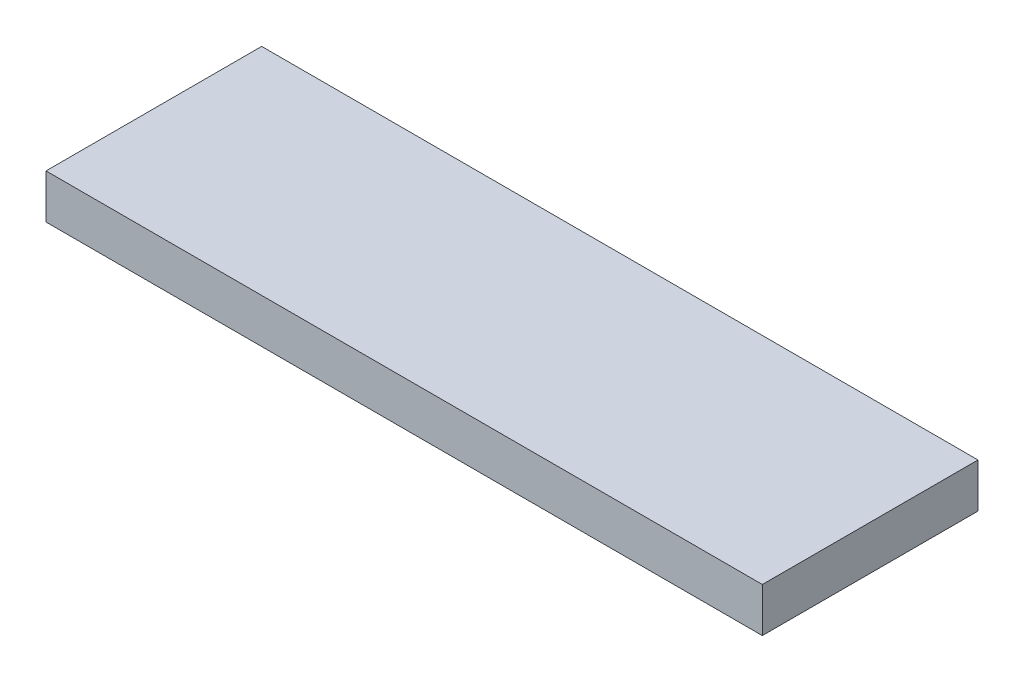
ISO-10303-21;
HEADER;
FILE_DESCRIPTION(('STEP AP214'),'2;1');
FILE_NAME('part.step','',(''),(''),'','','');
FILE_SCHEMA(('AUTOMOTIVE_DESIGN { 1 0 10303 214 1 1 1 1 }'));
ENDSEC;
DATA;
#1=APPLICATION_CONTEXT('core data for automotive mechanical design processes');
#2=APPLICATION_PROTOCOL_DEFINITION('international standard','automotive_design',2000,#1);
#3=PRODUCT_CONTEXT('',#1,'mechanical');
#4=PRODUCT('Part','Part','',(#3));
#5=PRODUCT_RELATED_PRODUCT_CATEGORY('part','',(#4));
#6=PRODUCT_DEFINITION_FORMATION('','',#4);
#7=PRODUCT_DEFINITION_CONTEXT('part definition',#1,'design');
#8=PRODUCT_DEFINITION('design','',#6,#7);
#9=PRODUCT_DEFINITION_SHAPE('','',#8);
#10=(LENGTH_UNIT() NAMED_UNIT(*) SI_UNIT(.MILLI.,.METRE.));
#11=(NAMED_UNIT(*) PLANE_ANGLE_UNIT() SI_UNIT($,.RADIAN.));
#12=(NAMED_UNIT(*) SI_UNIT($,.STERADIAN.) SOLID_ANGLE_UNIT());
#13=UNCERTAINTY_MEASURE_WITH_UNIT(LENGTH_MEASURE(1.E-05),#10,'distance_accuracy_value','');
#14=(GEOMETRIC_REPRESENTATION_CONTEXT(3) GLOBAL_UNCERTAINTY_ASSIGNED_CONTEXT((#13)) GLOBAL_UNIT_ASSIGNED_CONTEXT((#10,
#11,#12)) REPRESENTATION_CONTEXT('',''));
#15=CARTESIAN_POINT('',(0.,0.,0.));
#16=DIRECTION('',(0.,0.,1.));
#17=DIRECTION('',(1.,0.,0.));
#18=AXIS2_PLACEMENT_3D('',#15,#16,#17);
#19=CARTESIAN_POINT('',(147.6375,18.25625,-44.45));
#20=DIRECTION('',(-1.,0.,0.));
#21=DIRECTION('',(0.,0.,1.));
#22=AXIS2_PLACEMENT_3D('',#19,#20,#21);
#23=PLANE('',#22);
#24=DIRECTION('',(0.,0.,-1.));
#25=VECTOR('',#24,1.);
#26=CARTESIAN_POINT('',(147.6375,0.,-44.45));
#27=LINE('',#26,#25);
#28=CARTESIAN_POINT('',(147.6375,0.,44.45));
#29=VERTEX_POINT('',#28);
#30=CARTESIAN_POINT('',(147.6375,0.,-44.45));
#31=VERTEX_POINT('',#30);
#32=EDGE_CURVE('E96',#29,#31,#27,.T.);
#33=ORIENTED_EDGE('',*,*,#32,.T.);
#34=DIRECTION('',(0.,-1.,0.));
#35=VECTOR('',#34,1.);
#36=CARTESIAN_POINT('',(147.6375,18.25625,-44.45));
#37=LINE('',#36,#35);
#38=CARTESIAN_POINT('',(147.6375,18.25625,-44.45));
#39=VERTEX_POINT('',#38);
#40=EDGE_CURVE('E11',#39,#31,#37,.T.);
#41=ORIENTED_EDGE('',*,*,#40,.F.);
#42=DIRECTION('',(0.,0.,-1.));
#43=VECTOR('',#42,1.);
#44=CARTESIAN_POINT('',(147.6375,18.25625,-44.45));
#45=LINE('',#44,#43);
#46=CARTESIAN_POINT('',(147.6375,18.25625,44.45));
#47=VERTEX_POINT('',#46);
#48=EDGE_CURVE('E84',#47,#39,#45,.T.);
#49=ORIENTED_EDGE('',*,*,#48,.F.);
#50=DIRECTION('',(0.,-1.,0.));
#51=VECTOR('',#50,1.);
#52=CARTESIAN_POINT('',(147.6375,18.25625,44.45));
#53=LINE('',#52,#51);
#54=EDGE_CURVE('E92',#47,#29,#53,.T.);
#55=ORIENTED_EDGE('',*,*,#54,.T.);
#56=EDGE_LOOP('',(#33,#41,#49,#55));
#57=FACE_BOUND('',#56,.T.);
#58=ADVANCED_FACE('F33',(#57),#23,.F.);
#59=CARTESIAN_POINT('',(-147.6375,18.25625,-44.45));
#60=DIRECTION('',(0.,0.,1.));
#61=DIRECTION('',(1.,0.,0.));
#62=AXIS2_PLACEMENT_3D('',#59,#60,#61);
#63=PLANE('',#62);
#64=DIRECTION('',(-1.,0.,0.));
#65=VECTOR('',#64,1.);
#66=CARTESIAN_POINT('',(-147.6375,0.,-44.45));
#67=LINE('',#66,#65);
#68=CARTESIAN_POINT('',(-147.6375,0.,-44.45));
#69=VERTEX_POINT('',#68);
#70=EDGE_CURVE('E88',#31,#69,#67,.T.);
#71=ORIENTED_EDGE('',*,*,#70,.T.);
#72=DIRECTION('',(0.,-1.,0.));
#73=VECTOR('',#72,1.);
#74=CARTESIAN_POINT('',(-147.6375,18.25625,-44.45));
#75=LINE('',#74,#73);
#76=CARTESIAN_POINT('',(-147.6375,18.25625,-44.45));
#77=VERTEX_POINT('',#76);
#78=EDGE_CURVE('E41',#77,#69,#75,.T.);
#79=ORIENTED_EDGE('',*,*,#78,.F.);
#80=DIRECTION('',(-1.,0.,0.));
#81=VECTOR('',#80,1.);
#82=CARTESIAN_POINT('',(-147.6375,18.25625,-44.45));
#83=LINE('',#82,#81);
#84=EDGE_CURVE('E79',#39,#77,#83,.T.);
#85=ORIENTED_EDGE('',*,*,#84,.F.);
#86=ORIENTED_EDGE('',*,*,#40,.T.);
#87=EDGE_LOOP('',(#71,#79,#85,#86));
#88=FACE_BOUND('',#87,.T.);
#89=ADVANCED_FACE('F87',(#88),#63,.F.);
#90=CARTESIAN_POINT('',(-147.6375,18.25625,-44.45));
#91=DIRECTION('',(1.,0.,0.));
#92=DIRECTION('',(0.,0.,-1.));
#93=AXIS2_PLACEMENT_3D('',#90,#91,#92);
#94=PLANE('',#93);
#95=DIRECTION('',(0.,0.,1.));
#96=VECTOR('',#95,1.);
#97=CARTESIAN_POINT('',(-147.6375,0.,-44.45));
#98=LINE('',#97,#96);
#99=CARTESIAN_POINT('',(-147.6375,0.,44.45));
#100=VERTEX_POINT('',#99);
#101=EDGE_CURVE('E66',#69,#100,#98,.T.);
#102=ORIENTED_EDGE('',*,*,#101,.T.);
#103=DIRECTION('',(0.,-1.,0.));
#104=VECTOR('',#103,1.);
#105=CARTESIAN_POINT('',(-147.6375,18.25625,44.45));
#106=LINE('',#105,#104);
#107=CARTESIAN_POINT('',(-147.6375,18.25625,44.45));
#108=VERTEX_POINT('',#107);
#109=EDGE_CURVE('E89',#108,#100,#106,.T.);
#110=ORIENTED_EDGE('',*,*,#109,.F.);
#111=DIRECTION('',(0.,0.,1.));
#112=VECTOR('',#111,1.);
#113=CARTESIAN_POINT('',(-147.6375,18.25625,-44.45));
#114=LINE('',#113,#112);
#115=EDGE_CURVE('E82',#77,#108,#114,.T.);
#116=ORIENTED_EDGE('',*,*,#115,.F.);
#117=ORIENTED_EDGE('',*,*,#78,.T.);
#118=EDGE_LOOP('',(#102,#110,#116,#117));
#119=FACE_BOUND('',#118,.T.);
#120=ADVANCED_FACE('F90',(#119),#94,.F.);
#121=CARTESIAN_POINT('',(-147.6375,18.25625,44.45));
#122=DIRECTION('',(0.,0.,-1.));
#123=DIRECTION('',(-1.,0.,0.));
#124=AXIS2_PLACEMENT_3D('',#121,#122,#123);
#125=PLANE('',#124);
#126=DIRECTION('',(1.,0.,0.));
#127=VECTOR('',#126,1.);
#128=CARTESIAN_POINT('',(-147.6375,0.,44.45));
#129=LINE('',#128,#127);
#130=EDGE_CURVE('E72',#100,#29,#129,.T.);
#131=ORIENTED_EDGE('',*,*,#130,.T.);
#132=ORIENTED_EDGE('',*,*,#54,.F.);
#133=DIRECTION('',(1.,0.,0.));
#134=VECTOR('',#133,1.);
#135=CARTESIAN_POINT('',(-147.6375,18.25625,44.45));
#136=LINE('',#135,#134);
#137=EDGE_CURVE('E49',#108,#47,#136,.T.);
#138=ORIENTED_EDGE('',*,*,#137,.F.);
#139=ORIENTED_EDGE('',*,*,#109,.T.);
#140=EDGE_LOOP('',(#131,#132,#138,#139));
#141=FACE_BOUND('',#140,.T.);
#142=ADVANCED_FACE('F103',(#141),#125,.F.);
#143=CARTESIAN_POINT('',(0.,18.25625,0.));
#144=DIRECTION('',(0.,1.,0.));
#145=DIRECTION('',(0.,0.,1.));
#146=AXIS2_PLACEMENT_3D('',#143,#144,#145);
#147=PLANE('',#146);
#148=ORIENTED_EDGE('',*,*,#48,.T.);
#149=ORIENTED_EDGE('',*,*,#84,.T.);
#150=ORIENTED_EDGE('',*,*,#115,.T.);
#151=ORIENTED_EDGE('',*,*,#137,.T.);
#152=EDGE_LOOP('',(#148,#149,#150,#151));
#153=FACE_BOUND('',#152,.T.);
#154=ADVANCED_FACE('F80',(#153),#147,.T.);
#155=CARTESIAN_POINT('',(0.,0.,0.));
#156=DIRECTION('',(0.,1.,0.));
#157=DIRECTION('',(0.,0.,1.));
#158=AXIS2_PLACEMENT_3D('',#155,#156,#157);
#159=PLANE('',#158);
#160=ORIENTED_EDGE('',*,*,#32,.F.);
#161=ORIENTED_EDGE('',*,*,#130,.F.);
#162=ORIENTED_EDGE('',*,*,#101,.F.);
#163=ORIENTED_EDGE('',*,*,#70,.F.);
#164=EDGE_LOOP('',(#160,#161,#162,#163));
#165=FACE_BOUND('',#164,.T.);
#166=ADVANCED_FACE('F106',(#165),#159,.F.);
#167=CLOSED_SHELL('',(#58,#89,#120,#142,#154,#166));
#168=MANIFOLD_SOLID_BREP('B2',#167);
#169=ADVANCED_BREP_SHAPE_REPRESENTATION('',(#18,#168),#14);
#170=SHAPE_DEFINITION_REPRESENTATION(#9,#169);
ENDSEC;
END-ISO-10303-21;
